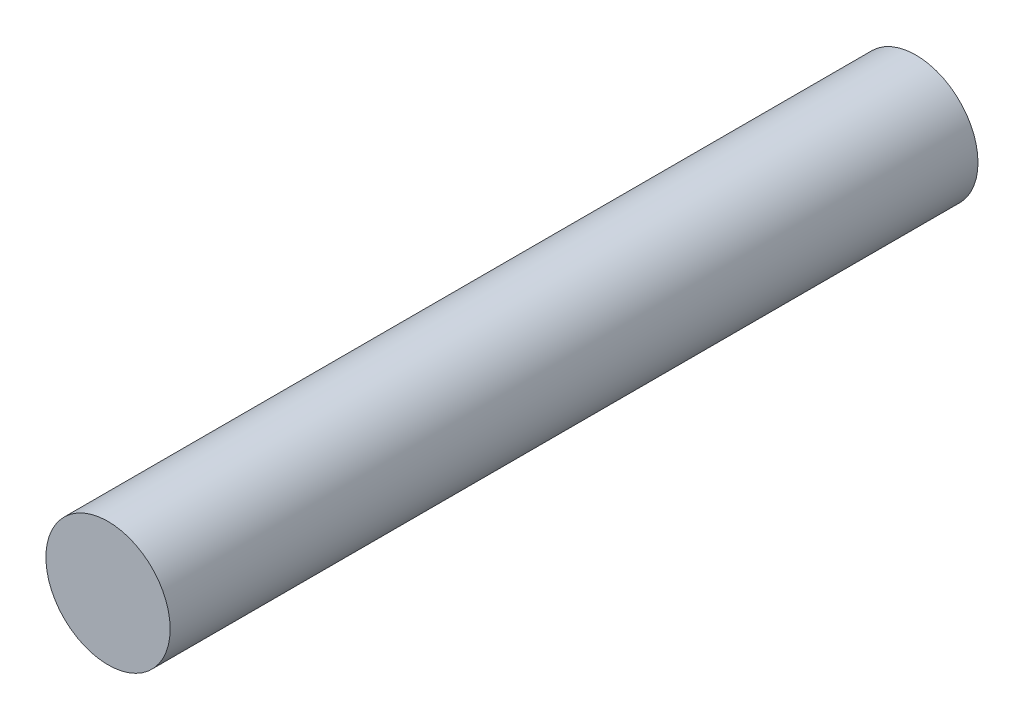
ISO-10303-21;
HEADER;
FILE_DESCRIPTION(('STEP AP214'),'2;1');
FILE_NAME('part.step','',(''),(''),'','','');
FILE_SCHEMA(('AUTOMOTIVE_DESIGN { 1 0 10303 214 1 1 1 1 }'));
ENDSEC;
DATA;
#1=APPLICATION_CONTEXT('core data for automotive mechanical design processes');
#2=APPLICATION_PROTOCOL_DEFINITION('international standard','automotive_design',2000,#1);
#3=PRODUCT_CONTEXT('',#1,'mechanical');
#4=PRODUCT('Part','Part','',(#3));
#5=PRODUCT_RELATED_PRODUCT_CATEGORY('part','',(#4));
#6=PRODUCT_DEFINITION_FORMATION('','',#4);
#7=PRODUCT_DEFINITION_CONTEXT('part definition',#1,'design');
#8=PRODUCT_DEFINITION('design','',#6,#7);
#9=PRODUCT_DEFINITION_SHAPE('','',#8);
#10=(LENGTH_UNIT() NAMED_UNIT(*) SI_UNIT(.MILLI.,.METRE.));
#11=(NAMED_UNIT(*) PLANE_ANGLE_UNIT() SI_UNIT($,.RADIAN.));
#12=(NAMED_UNIT(*) SI_UNIT($,.STERADIAN.) SOLID_ANGLE_UNIT());
#13=UNCERTAINTY_MEASURE_WITH_UNIT(LENGTH_MEASURE(1.E-05),#10,'distance_accuracy_value','');
#14=(GEOMETRIC_REPRESENTATION_CONTEXT(3) GLOBAL_UNCERTAINTY_ASSIGNED_CONTEXT((#13)) GLOBAL_UNIT_ASSIGNED_CONTEXT((#10,
#11,#12)) REPRESENTATION_CONTEXT('',''));
#15=CARTESIAN_POINT('',(0.,0.,0.));
#16=DIRECTION('',(0.,0.,1.));
#17=DIRECTION('',(1.,0.,0.));
#18=AXIS2_PLACEMENT_3D('',#15,#16,#17);
#19=CARTESIAN_POINT('',(0.,0.,82.55));
#20=DIRECTION('',(0.,0.,-1.));
#21=DIRECTION('',(-1.,0.,0.));
#22=AXIS2_PLACEMENT_3D('',#19,#20,#21);
#23=CYLINDRICAL_SURFACE('',#22,6.35);
#24=CARTESIAN_POINT('',(0.,0.,82.55));
#25=DIRECTION('',(0.,0.,1.));
#26=DIRECTION('',(1.,0.,0.));
#27=AXIS2_PLACEMENT_3D('',#24,#25,#26);
#28=CIRCLE('',#27,6.35);
#29=CARTESIAN_POINT('',(6.35,0.,82.55));
#30=VERTEX_POINT('',#29);
#31=EDGE_CURVE('E10',#30,#30,#28,.T.);
#32=ORIENTED_EDGE('',*,*,#31,.F.);
#33=EDGE_LOOP('',(#32));
#34=FACE_BOUND('',#33,.T.);
#35=CARTESIAN_POINT('',(0.,0.,0.));
#36=DIRECTION('',(0.,0.,1.));
#37=DIRECTION('',(1.,0.,0.));
#38=AXIS2_PLACEMENT_3D('',#35,#36,#37);
#39=CIRCLE('',#38,6.35);
#40=CARTESIAN_POINT('',(6.35,0.,0.));
#41=VERTEX_POINT('',#40);
#42=EDGE_CURVE('E44',#41,#41,#39,.T.);
#43=ORIENTED_EDGE('',*,*,#42,.T.);
#44=EDGE_LOOP('',(#43));
#45=FACE_BOUND('',#44,.T.);
#46=ADVANCED_FACE('F41',(#34,#45),#23,.T.);
#47=CARTESIAN_POINT('',(0.,0.,82.55));
#48=DIRECTION('',(0.,0.,1.));
#49=DIRECTION('',(1.,0.,0.));
#50=AXIS2_PLACEMENT_3D('',#47,#48,#49);
#51=PLANE('',#50);
#52=ORIENTED_EDGE('',*,*,#31,.T.);
#53=EDGE_LOOP('',(#52));
#54=FACE_BOUND('',#53,.T.);
#55=ADVANCED_FACE('F58',(#54),#51,.T.);
#56=CARTESIAN_POINT('',(0.,0.,0.));
#57=DIRECTION('',(0.,0.,1.));
#58=DIRECTION('',(1.,0.,0.));
#59=AXIS2_PLACEMENT_3D('',#56,#57,#58);
#60=PLANE('',#59);
#61=ORIENTED_EDGE('',*,*,#42,.F.);
#62=EDGE_LOOP('',(#61));
#63=FACE_BOUND('',#62,.T.);
#64=ADVANCED_FACE('F56',(#63),#60,.F.);
#65=CLOSED_SHELL('',(#46,#55,#64));
#66=MANIFOLD_SOLID_BREP('B2',#65);
#67=ADVANCED_BREP_SHAPE_REPRESENTATION('',(#18,#66),#14);
#68=SHAPE_DEFINITION_REPRESENTATION(#9,#67);
ENDSEC;
END-ISO-10303-21;
